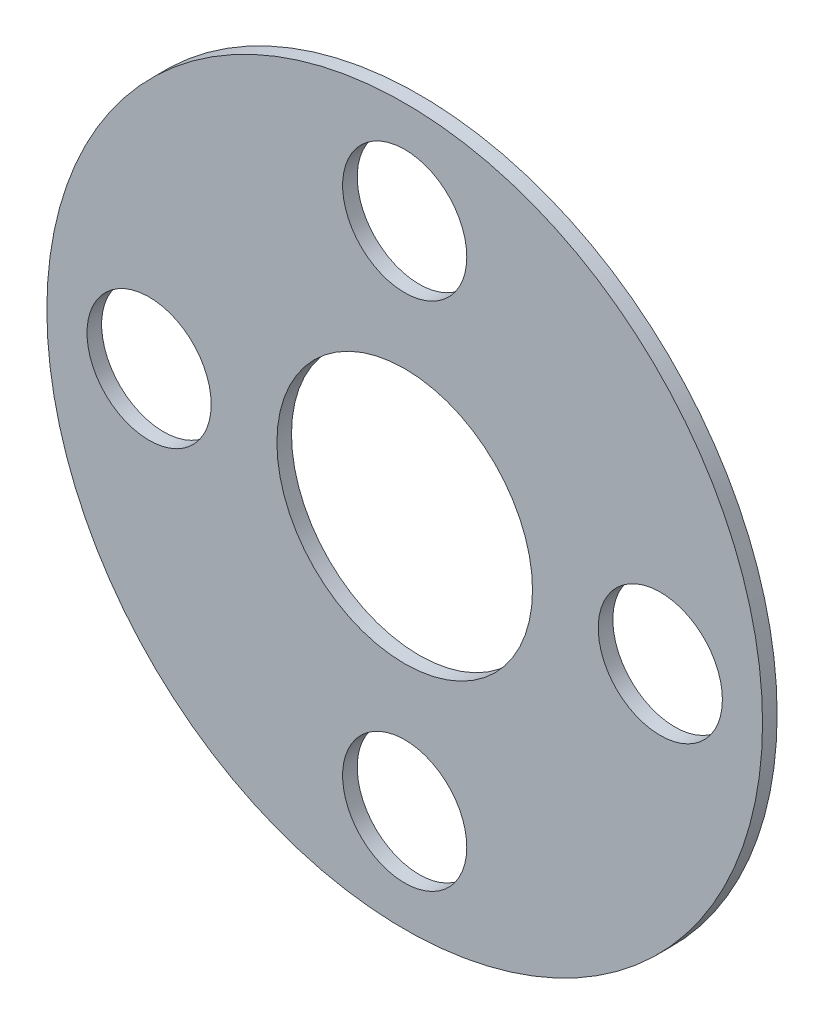
ISO-10303-21;
HEADER;
FILE_DESCRIPTION(('STEP AP214'),'2;1');
FILE_NAME('part.step','',(''),(''),'','','');
FILE_SCHEMA(('AUTOMOTIVE_DESIGN { 1 0 10303 214 1 1 1 1 }'));
ENDSEC;
DATA;
#1=APPLICATION_CONTEXT('core data for automotive mechanical design processes');
#2=APPLICATION_PROTOCOL_DEFINITION('international standard','automotive_design',2000,#1);
#3=PRODUCT_CONTEXT('',#1,'mechanical');
#4=PRODUCT('Part','Part','',(#3));
#5=PRODUCT_RELATED_PRODUCT_CATEGORY('part','',(#4));
#6=PRODUCT_DEFINITION_FORMATION('','',#4);
#7=PRODUCT_DEFINITION_CONTEXT('part definition',#1,'design');
#8=PRODUCT_DEFINITION('design','',#6,#7);
#9=PRODUCT_DEFINITION_SHAPE('','',#8);
#10=(LENGTH_UNIT() NAMED_UNIT(*) SI_UNIT(.MILLI.,.METRE.));
#11=(NAMED_UNIT(*) PLANE_ANGLE_UNIT() SI_UNIT($,.RADIAN.));
#12=(NAMED_UNIT(*) SI_UNIT($,.STERADIAN.) SOLID_ANGLE_UNIT());
#13=UNCERTAINTY_MEASURE_WITH_UNIT(LENGTH_MEASURE(1.E-05),#10,'distance_accuracy_value','');
#14=(GEOMETRIC_REPRESENTATION_CONTEXT(3) GLOBAL_UNCERTAINTY_ASSIGNED_CONTEXT((#13)) GLOBAL_UNIT_ASSIGNED_CONTEXT((#10,
#11,#12)) REPRESENTATION_CONTEXT('',''));
#15=CARTESIAN_POINT('',(0.,0.,0.));
#16=DIRECTION('',(0.,0.,1.));
#17=DIRECTION('',(1.,0.,0.));
#18=AXIS2_PLACEMENT_3D('',#15,#16,#17);
#19=CARTESIAN_POINT('',(0.,0.,0.4));
#20=DIRECTION('',(0.,0.,-1.));
#21=DIRECTION('',(-1.,0.,0.));
#22=AXIS2_PLACEMENT_3D('',#19,#20,#21);
#23=CYLINDRICAL_SURFACE('',#22,9.8);
#24=CARTESIAN_POINT('',(0.,0.,0.4));
#25=DIRECTION('',(0.,0.,1.));
#26=DIRECTION('',(1.,0.,0.));
#27=AXIS2_PLACEMENT_3D('',#24,#25,#26);
#28=CIRCLE('',#27,9.8);
#29=CARTESIAN_POINT('',(9.8,0.,0.4));
#30=VERTEX_POINT('',#29);
#31=EDGE_CURVE('E10',#30,#30,#28,.T.);
#32=ORIENTED_EDGE('',*,*,#31,.F.);
#33=EDGE_LOOP('',(#32));
#34=FACE_BOUND('',#33,.T.);
#35=CARTESIAN_POINT('',(0.,0.,0.));
#36=DIRECTION('',(0.,0.,1.));
#37=DIRECTION('',(1.,0.,0.));
#38=AXIS2_PLACEMENT_3D('',#35,#36,#37);
#39=CIRCLE('',#38,9.8);
#40=CARTESIAN_POINT('',(9.8,0.,0.));
#41=VERTEX_POINT('',#40);
#42=EDGE_CURVE('E42',#41,#41,#39,.T.);
#43=ORIENTED_EDGE('',*,*,#42,.T.);
#44=EDGE_LOOP('',(#43));
#45=FACE_BOUND('',#44,.T.);
#46=ADVANCED_FACE('F40',(#34,#45),#23,.T.);
#47=CARTESIAN_POINT('',(0.,0.,0.4));
#48=DIRECTION('',(0.,0.,1.));
#49=DIRECTION('',(1.,0.,0.));
#50=AXIS2_PLACEMENT_3D('',#47,#48,#49);
#51=PLANE('',#50);
#52=CARTESIAN_POINT('',(0.,-7.,0.4));
#53=DIRECTION('',(0.,0.,1.));
#54=DIRECTION('',(1.,0.,0.));
#55=AXIS2_PLACEMENT_3D('',#52,#53,#54);
#56=CIRCLE('',#55,1.7);
#57=CARTESIAN_POINT('',(1.7,-7.,0.4));
#58=VERTEX_POINT('',#57);
#59=EDGE_CURVE('E69',#58,#58,#56,.F.);
#60=ORIENTED_EDGE('',*,*,#59,.T.);
#61=EDGE_LOOP('',(#60));
#62=FACE_BOUND('',#61,.T.);
#63=CARTESIAN_POINT('',(-7.,0.,0.4));
#64=DIRECTION('',(0.,0.,1.));
#65=DIRECTION('',(1.,0.,0.));
#66=AXIS2_PLACEMENT_3D('',#63,#64,#65);
#67=CIRCLE('',#66,1.7);
#68=CARTESIAN_POINT('',(-5.3,0.,0.4));
#69=VERTEX_POINT('',#68);
#70=EDGE_CURVE('E63',#69,#69,#67,.F.);
#71=ORIENTED_EDGE('',*,*,#70,.T.);
#72=EDGE_LOOP('',(#71));
#73=FACE_BOUND('',#72,.T.);
#74=CARTESIAN_POINT('',(0.,7.,0.4));
#75=DIRECTION('',(0.,0.,1.));
#76=DIRECTION('',(1.,0.,0.));
#77=AXIS2_PLACEMENT_3D('',#74,#75,#76);
#78=CIRCLE('',#77,1.7);
#79=CARTESIAN_POINT('',(1.7,7.,0.4));
#80=VERTEX_POINT('',#79);
#81=EDGE_CURVE('E61',#80,#80,#78,.F.);
#82=ORIENTED_EDGE('',*,*,#81,.T.);
#83=EDGE_LOOP('',(#82));
#84=FACE_BOUND('',#83,.T.);
#85=CARTESIAN_POINT('',(7.,0.,0.4));
#86=DIRECTION('',(0.,0.,1.));
#87=DIRECTION('',(1.,0.,0.));
#88=AXIS2_PLACEMENT_3D('',#85,#86,#87);
#89=CIRCLE('',#88,1.7);
#90=CARTESIAN_POINT('',(8.7,0.,0.4));
#91=VERTEX_POINT('',#90);
#92=EDGE_CURVE('E60',#91,#91,#89,.F.);
#93=ORIENTED_EDGE('',*,*,#92,.T.);
#94=EDGE_LOOP('',(#93));
#95=FACE_BOUND('',#94,.T.);
#96=CARTESIAN_POINT('',(0.,0.,0.4));
#97=DIRECTION('',(0.,0.,1.));
#98=DIRECTION('',(1.,0.,0.));
#99=AXIS2_PLACEMENT_3D('',#96,#97,#98);
#100=CIRCLE('',#99,3.5);
#101=CARTESIAN_POINT('',(3.5,0.,0.4));
#102=VERTEX_POINT('',#101);
#103=EDGE_CURVE('E47',#102,#102,#100,.F.);
#104=ORIENTED_EDGE('',*,*,#103,.T.);
#105=EDGE_LOOP('',(#104));
#106=FACE_BOUND('',#105,.T.);
#107=ORIENTED_EDGE('',*,*,#31,.T.);
#108=EDGE_LOOP('',(#107));
#109=FACE_BOUND('',#108,.T.);
#110=ADVANCED_FACE('F84',(#62,#73,#84,#95,#106,#109),#51,.T.);
#111=CARTESIAN_POINT('',(0.,0.,0.));
#112=DIRECTION('',(0.,0.,1.));
#113=DIRECTION('',(1.,0.,0.));
#114=AXIS2_PLACEMENT_3D('',#111,#112,#113);
#115=PLANE('',#114);
#116=CARTESIAN_POINT('',(0.,-7.,0.));
#117=DIRECTION('',(0.,0.,1.));
#118=DIRECTION('',(1.,0.,0.));
#119=AXIS2_PLACEMENT_3D('',#116,#117,#118);
#120=CIRCLE('',#119,1.7);
#121=CARTESIAN_POINT('',(1.7,-7.,0.));
#122=VERTEX_POINT('',#121);
#123=EDGE_CURVE('E37',#122,#122,#120,.F.);
#124=ORIENTED_EDGE('',*,*,#123,.F.);
#125=EDGE_LOOP('',(#124));
#126=FACE_BOUND('',#125,.T.);
#127=CARTESIAN_POINT('',(-7.,0.,0.));
#128=DIRECTION('',(0.,0.,1.));
#129=DIRECTION('',(1.,0.,0.));
#130=AXIS2_PLACEMENT_3D('',#127,#128,#129);
#131=CIRCLE('',#130,1.7);
#132=CARTESIAN_POINT('',(-5.3,0.,0.));
#133=VERTEX_POINT('',#132);
#134=EDGE_CURVE('E65',#133,#133,#131,.F.);
#135=ORIENTED_EDGE('',*,*,#134,.F.);
#136=EDGE_LOOP('',(#135));
#137=FACE_BOUND('',#136,.T.);
#138=CARTESIAN_POINT('',(0.,7.,0.));
#139=DIRECTION('',(0.,0.,1.));
#140=DIRECTION('',(1.,0.,0.));
#141=AXIS2_PLACEMENT_3D('',#138,#139,#140);
#142=CIRCLE('',#141,1.7);
#143=CARTESIAN_POINT('',(1.7,7.,0.));
#144=VERTEX_POINT('',#143);
#145=EDGE_CURVE('E62',#144,#144,#142,.F.);
#146=ORIENTED_EDGE('',*,*,#145,.F.);
#147=EDGE_LOOP('',(#146));
#148=FACE_BOUND('',#147,.T.);
#149=CARTESIAN_POINT('',(7.,0.,0.));
#150=DIRECTION('',(0.,0.,1.));
#151=DIRECTION('',(1.,0.,0.));
#152=AXIS2_PLACEMENT_3D('',#149,#150,#151);
#153=CIRCLE('',#152,1.7);
#154=CARTESIAN_POINT('',(8.7,0.,0.));
#155=VERTEX_POINT('',#154);
#156=EDGE_CURVE('E59',#155,#155,#153,.F.);
#157=ORIENTED_EDGE('',*,*,#156,.F.);
#158=EDGE_LOOP('',(#157));
#159=FACE_BOUND('',#158,.T.);
#160=CARTESIAN_POINT('',(0.,0.,0.));
#161=DIRECTION('',(0.,0.,1.));
#162=DIRECTION('',(1.,0.,0.));
#163=AXIS2_PLACEMENT_3D('',#160,#161,#162);
#164=CIRCLE('',#163,3.5);
#165=CARTESIAN_POINT('',(3.5,0.,0.));
#166=VERTEX_POINT('',#165);
#167=EDGE_CURVE('E53',#166,#166,#164,.F.);
#168=ORIENTED_EDGE('',*,*,#167,.F.);
#169=EDGE_LOOP('',(#168));
#170=FACE_BOUND('',#169,.T.);
#171=ORIENTED_EDGE('',*,*,#42,.F.);
#172=EDGE_LOOP('',(#171));
#173=FACE_BOUND('',#172,.T.);
#174=ADVANCED_FACE('F91',(#126,#137,#148,#159,#170,#173),#115,.F.);
#175=CARTESIAN_POINT('',(0.,0.,0.5));
#176=DIRECTION('',(0.,0.,-1.));
#177=DIRECTION('',(-1.,0.,0.));
#178=AXIS2_PLACEMENT_3D('',#175,#176,#177);
#179=CYLINDRICAL_SURFACE('',#178,3.5);
#180=ORIENTED_EDGE('',*,*,#103,.F.);
#181=EDGE_LOOP('',(#180));
#182=FACE_BOUND('',#181,.T.);
#183=ORIENTED_EDGE('',*,*,#167,.T.);
#184=EDGE_LOOP('',(#183));
#185=FACE_BOUND('',#184,.T.);
#186=ADVANCED_FACE('F90',(#182,#185),#179,.F.);
#187=CARTESIAN_POINT('',(7.,0.,0.5));
#188=DIRECTION('',(0.,0.,-1.));
#189=DIRECTION('',(-1.,0.,0.));
#190=AXIS2_PLACEMENT_3D('',#187,#188,#189);
#191=CYLINDRICAL_SURFACE('',#190,1.7);
#192=ORIENTED_EDGE('',*,*,#92,.F.);
#193=EDGE_LOOP('',(#192));
#194=FACE_BOUND('',#193,.T.);
#195=ORIENTED_EDGE('',*,*,#156,.T.);
#196=EDGE_LOOP('',(#195));
#197=FACE_BOUND('',#196,.T.);
#198=ADVANCED_FACE('F81',(#194,#197),#191,.F.);
#199=CARTESIAN_POINT('',(0.,7.,0.5));
#200=DIRECTION('',(0.,0.,-1.));
#201=DIRECTION('',(-1.,0.,0.));
#202=AXIS2_PLACEMENT_3D('',#199,#200,#201);
#203=CYLINDRICAL_SURFACE('',#202,1.7);
#204=ORIENTED_EDGE('',*,*,#81,.F.);
#205=EDGE_LOOP('',(#204));
#206=FACE_BOUND('',#205,.T.);
#207=ORIENTED_EDGE('',*,*,#145,.T.);
#208=EDGE_LOOP('',(#207));
#209=FACE_BOUND('',#208,.T.);
#210=ADVANCED_FACE('F86',(#206,#209),#203,.F.);
#211=CARTESIAN_POINT('',(-7.,0.,0.5));
#212=DIRECTION('',(0.,0.,-1.));
#213=DIRECTION('',(-1.,0.,0.));
#214=AXIS2_PLACEMENT_3D('',#211,#212,#213);
#215=CYLINDRICAL_SURFACE('',#214,1.7);
#216=ORIENTED_EDGE('',*,*,#70,.F.);
#217=EDGE_LOOP('',(#216));
#218=FACE_BOUND('',#217,.T.);
#219=ORIENTED_EDGE('',*,*,#134,.T.);
#220=EDGE_LOOP('',(#219));
#221=FACE_BOUND('',#220,.T.);
#222=ADVANCED_FACE('F117',(#218,#221),#215,.F.);
#223=CARTESIAN_POINT('',(0.,-7.,0.5));
#224=DIRECTION('',(0.,0.,-1.));
#225=DIRECTION('',(-1.,0.,0.));
#226=AXIS2_PLACEMENT_3D('',#223,#224,#225);
#227=CYLINDRICAL_SURFACE('',#226,1.7);
#228=ORIENTED_EDGE('',*,*,#59,.F.);
#229=EDGE_LOOP('',(#228));
#230=FACE_BOUND('',#229,.T.);
#231=ORIENTED_EDGE('',*,*,#123,.T.);
#232=EDGE_LOOP('',(#231));
#233=FACE_BOUND('',#232,.T.);
#234=ADVANCED_FACE('F120',(#230,#233),#227,.F.);
#235=CLOSED_SHELL('',(#46,#110,#174,#186,#198,#210,#222,#234));
#236=MANIFOLD_SOLID_BREP('B2',#235);
#237=ADVANCED_BREP_SHAPE_REPRESENTATION('',(#18,#236),#14);
#238=SHAPE_DEFINITION_REPRESENTATION(#9,#237);
ENDSEC;
END-ISO-10303-21;
